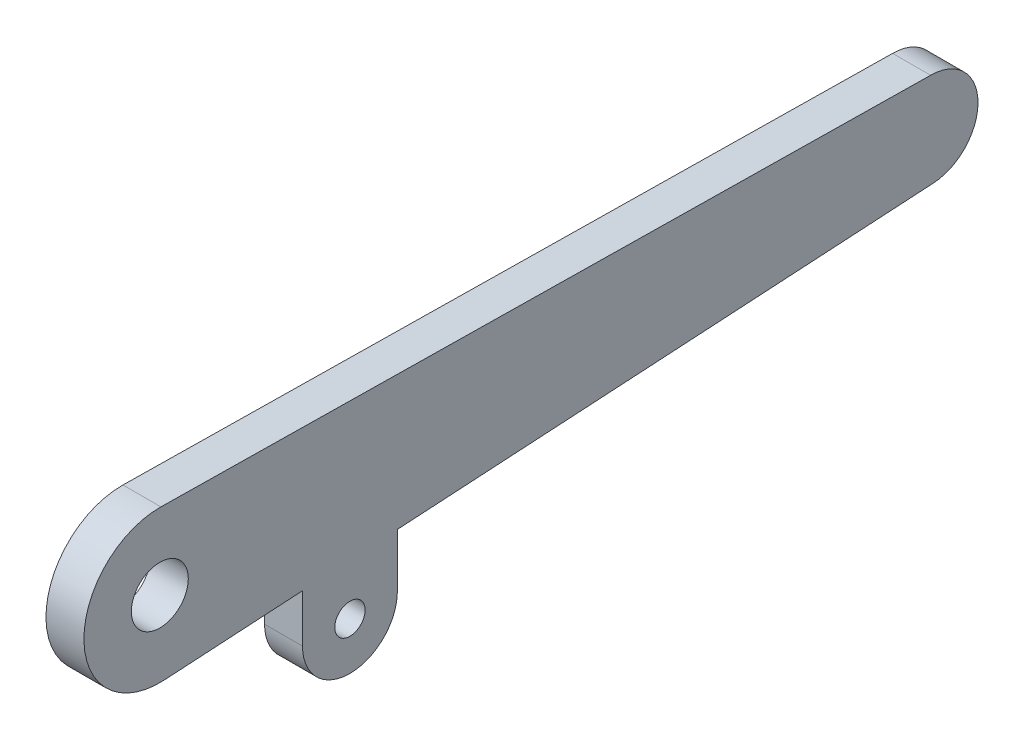
ISO-10303-21;
HEADER;
FILE_DESCRIPTION(('STEP AP214'),'2;1');
FILE_NAME('part.step','',(''),(''),'','','');
FILE_SCHEMA(('AUTOMOTIVE_DESIGN { 1 0 10303 214 1 1 1 1 }'));
ENDSEC;
DATA;
#1=APPLICATION_CONTEXT('core data for automotive mechanical design processes');
#2=APPLICATION_PROTOCOL_DEFINITION('international standard','automotive_design',2000,#1);
#3=PRODUCT_CONTEXT('',#1,'mechanical');
#4=PRODUCT('Part','Part','',(#3));
#5=PRODUCT_RELATED_PRODUCT_CATEGORY('part','',(#4));
#6=PRODUCT_DEFINITION_FORMATION('','',#4);
#7=PRODUCT_DEFINITION_CONTEXT('part definition',#1,'design');
#8=PRODUCT_DEFINITION('design','',#6,#7);
#9=PRODUCT_DEFINITION_SHAPE('','',#8);
#10=(LENGTH_UNIT() NAMED_UNIT(*) SI_UNIT(.MILLI.,.METRE.));
#11=(NAMED_UNIT(*) PLANE_ANGLE_UNIT() SI_UNIT($,.RADIAN.));
#12=(NAMED_UNIT(*) SI_UNIT($,.STERADIAN.) SOLID_ANGLE_UNIT());
#13=UNCERTAINTY_MEASURE_WITH_UNIT(LENGTH_MEASURE(1.E-05),#10,'distance_accuracy_value','');
#14=(GEOMETRIC_REPRESENTATION_CONTEXT(3) GLOBAL_UNCERTAINTY_ASSIGNED_CONTEXT((#13)) GLOBAL_UNIT_ASSIGNED_CONTEXT((#10,
#11,#12)) REPRESENTATION_CONTEXT('',''));
#15=CARTESIAN_POINT('',(0.,0.,0.));
#16=DIRECTION('',(0.,0.,1.));
#17=DIRECTION('',(1.,0.,0.));
#18=AXIS2_PLACEMENT_3D('',#15,#16,#17);
#19=CARTESIAN_POINT('',(4.,0.,0.));
#20=DIRECTION('',(1.,0.,0.));
#21=DIRECTION('',(0.,0.,-1.));
#22=AXIS2_PLACEMENT_3D('',#19,#20,#21);
#23=PLANE('',#22);
#24=CARTESIAN_POINT('',(4.,-12.1735942097107,-20.0375638568582));
#25=DIRECTION('',(1.,0.,0.));
#26=DIRECTION('',(0.,0.,-1.));
#27=AXIS2_PLACEMENT_3D('',#24,#25,#26);
#28=CIRCLE('',#27,1.6);
#29=CARTESIAN_POINT('',(4.,-12.1735942097107,-21.6375638568582));
#30=VERTEX_POINT('',#29);
#31=EDGE_CURVE('E135',#30,#30,#28,.T.);
#32=ORIENTED_EDGE('',*,*,#31,.F.);
#33=EDGE_LOOP('',(#32));
#34=FACE_BOUND('',#33,.T.);
#35=CARTESIAN_POINT('',(4.,0.,0.));
#36=DIRECTION('',(1.,0.,0.));
#37=DIRECTION('',(0.,0.,-1.));
#38=AXIS2_PLACEMENT_3D('',#35,#36,#37);
#39=CIRCLE('',#38,8.);
#40=CARTESIAN_POINT('',(4.,7.99917321703442,-0.115012364027337));
#41=VERTEX_POINT('',#40);
#42=CARTESIAN_POINT('',(4.,-7.98585386877995,-0.475539679198605));
#43=VERTEX_POINT('',#42);
#44=EDGE_CURVE('E146',#41,#43,#39,.T.);
#45=ORIENTED_EDGE('',*,*,#44,.T.);
#46=DIRECTION('',(0.,0.0594424598998259,-0.998231733597494));
#47=VECTOR('',#46,1.);
#48=CARTESIAN_POINT('',(4.,-7.98585386877995,-0.475539679198605));
#49=LINE('',#48,#47);
#50=CARTESIAN_POINT('',(4.,-7.11871800332183,-15.0375638568582));
#51=VERTEX_POINT('',#50);
#52=EDGE_CURVE('E94',#43,#51,#49,.T.);
#53=ORIENTED_EDGE('',*,*,#52,.T.);
#54=DIRECTION('',(0.,-1.,0.));
#55=VECTOR('',#54,1.);
#56=CARTESIAN_POINT('',(4.,-12.1735942097107,-15.0375638568582));
#57=LINE('',#56,#55);
#58=CARTESIAN_POINT('',(4.,-12.1735942097107,-15.0375638568582));
#59=VERTEX_POINT('',#58);
#60=EDGE_CURVE('E161',#51,#59,#57,.T.);
#61=ORIENTED_EDGE('',*,*,#60,.T.);
#62=CARTESIAN_POINT('',(4.,-12.1735942097107,-20.0375638568582));
#63=DIRECTION('',(1.,0.,0.));
#64=DIRECTION('',(0.,0.,-1.));
#65=AXIS2_PLACEMENT_3D('',#62,#63,#64);
#66=CIRCLE('',#65,5.);
#67=CARTESIAN_POINT('',(4.,-12.1735942097107,-25.0375638568582));
#68=VERTEX_POINT('',#67);
#69=EDGE_CURVE('E174',#59,#68,#66,.T.);
#70=ORIENTED_EDGE('',*,*,#69,.T.);
#71=DIRECTION('',(0.,1.,0.));
#72=VECTOR('',#71,1.);
#73=CARTESIAN_POINT('',(4.,-12.1735942097107,-25.0375638568582));
#74=LINE('',#73,#72);
#75=CARTESIAN_POINT('',(4.,-6.5232404413573,-25.0375638568582));
#76=VERTEX_POINT('',#75);
#77=EDGE_CURVE('E113',#68,#76,#74,.T.);
#78=ORIENTED_EDGE('',*,*,#77,.T.);
#79=DIRECTION('',(0.,0.0594424598998256,-0.998231733597494));
#80=VECTOR('',#79,1.);
#81=CARTESIAN_POINT('',(4.,-6.5232404413573,-25.0375638568582));
#82=LINE('',#81,#80);
#83=CARTESIAN_POINT('',(4.,-3.15848283091089,-81.5427594404807));
#84=VERTEX_POINT('',#83);
#85=EDGE_CURVE('E107',#76,#84,#82,.T.);
#86=ORIENTED_EDGE('',*,*,#85,.T.);
#87=CARTESIAN_POINT('',(4.,1.83267583707658,-81.2455471409816));
#88=DIRECTION('',(1.,0.,0.));
#89=DIRECTION('',(0.,0.,-1.));
#90=AXIS2_PLACEMENT_3D('',#87,#88,#89);
#91=CIRCLE('',#90,5.);
#92=CARTESIAN_POINT('',(4.,6.83267583707658,-81.2455471409816));
#93=VERTEX_POINT('',#92);
#94=EDGE_CURVE('E111',#84,#93,#91,.T.);
#95=ORIENTED_EDGE('',*,*,#94,.T.);
#96=DIRECTION('',(0.,0.0143765455034171,0.999896652129303));
#97=VECTOR('',#96,1.);
#98=CARTESIAN_POINT('',(4.,7.99917321703442,-0.115012364027337));
#99=LINE('',#98,#97);
#100=EDGE_CURVE('E51',#93,#41,#99,.T.);
#101=ORIENTED_EDGE('',*,*,#100,.T.);
#102=EDGE_LOOP('',(#45,#53,#61,#70,#78,#86,#95,#101));
#103=FACE_BOUND('',#102,.T.);
#104=CARTESIAN_POINT('',(4.,0.,0.));
#105=DIRECTION('',(1.,0.,0.));
#106=DIRECTION('',(0.,0.,-1.));
#107=AXIS2_PLACEMENT_3D('',#104,#105,#106);
#108=CIRCLE('',#107,3.);
#109=CARTESIAN_POINT('',(4.,0.,-3.));
#110=VERTEX_POINT('',#109);
#111=EDGE_CURVE('E183',#110,#110,#108,.T.);
#112=ORIENTED_EDGE('',*,*,#111,.F.);
#113=EDGE_LOOP('',(#112));
#114=FACE_BOUND('',#113,.T.);
#115=ADVANCED_FACE('F34',(#34,#103,#114),#23,.T.);
#116=CARTESIAN_POINT('',(0.,0.,0.));
#117=DIRECTION('',(1.,0.,0.));
#118=DIRECTION('',(0.,0.,-1.));
#119=AXIS2_PLACEMENT_3D('',#116,#117,#118);
#120=PLANE('',#119);
#121=CARTESIAN_POINT('',(0.,0.,0.));
#122=DIRECTION('',(1.,0.,0.));
#123=DIRECTION('',(0.,0.,-1.));
#124=AXIS2_PLACEMENT_3D('',#121,#122,#123);
#125=CIRCLE('',#124,8.);
#126=CARTESIAN_POINT('',(0.,7.99917321703442,-0.115012364027337));
#127=VERTEX_POINT('',#126);
#128=CARTESIAN_POINT('',(0.,-7.98585386877995,-0.475539679198605));
#129=VERTEX_POINT('',#128);
#130=EDGE_CURVE('E131',#127,#129,#125,.T.);
#131=ORIENTED_EDGE('',*,*,#130,.F.);
#132=DIRECTION('',(0.,0.0143765455034171,0.999896652129303));
#133=VECTOR('',#132,1.);
#134=CARTESIAN_POINT('',(0.,7.99917321703442,-0.115012364027337));
#135=LINE('',#134,#133);
#136=CARTESIAN_POINT('',(0.,6.83267583707658,-81.2455471409816));
#137=VERTEX_POINT('',#136);
#138=EDGE_CURVE('E86',#137,#127,#135,.T.);
#139=ORIENTED_EDGE('',*,*,#138,.F.);
#140=CARTESIAN_POINT('',(0.,1.83267583707658,-81.2455471409816));
#141=DIRECTION('',(1.,0.,0.));
#142=DIRECTION('',(0.,0.,-1.));
#143=AXIS2_PLACEMENT_3D('',#140,#141,#142);
#144=CIRCLE('',#143,5.);
#145=CARTESIAN_POINT('',(0.,-3.15848283091089,-81.5427594404807));
#146=VERTEX_POINT('',#145);
#147=EDGE_CURVE('E80',#146,#137,#144,.T.);
#148=ORIENTED_EDGE('',*,*,#147,.F.);
#149=DIRECTION('',(0.,0.0594424598998256,-0.998231733597494));
#150=VECTOR('',#149,1.);
#151=CARTESIAN_POINT('',(0.,-6.5232404413573,-25.0375638568582));
#152=LINE('',#151,#150);
#153=CARTESIAN_POINT('',(0.,-6.5232404413573,-25.0375638568582));
#154=VERTEX_POINT('',#153);
#155=EDGE_CURVE('E121',#154,#146,#152,.T.);
#156=ORIENTED_EDGE('',*,*,#155,.F.);
#157=DIRECTION('',(0.,1.,0.));
#158=VECTOR('',#157,1.);
#159=CARTESIAN_POINT('',(0.,-12.1735942097107,-25.0375638568582));
#160=LINE('',#159,#158);
#161=CARTESIAN_POINT('',(0.,-12.1735942097107,-25.0375638568582));
#162=VERTEX_POINT('',#161);
#163=EDGE_CURVE('E141',#162,#154,#160,.T.);
#164=ORIENTED_EDGE('',*,*,#163,.F.);
#165=CARTESIAN_POINT('',(0.,-12.1735942097107,-20.0375638568582));
#166=DIRECTION('',(1.,0.,0.));
#167=DIRECTION('',(0.,0.,-1.));
#168=AXIS2_PLACEMENT_3D('',#165,#166,#167);
#169=CIRCLE('',#168,5.);
#170=CARTESIAN_POINT('',(0.,-12.1735942097107,-15.0375638568582));
#171=VERTEX_POINT('',#170);
#172=EDGE_CURVE('E139',#171,#162,#169,.T.);
#173=ORIENTED_EDGE('',*,*,#172,.F.);
#174=DIRECTION('',(0.,-1.,0.));
#175=VECTOR('',#174,1.);
#176=CARTESIAN_POINT('',(0.,-12.1735942097107,-15.0375638568582));
#177=LINE('',#176,#175);
#178=CARTESIAN_POINT('',(0.,-7.11871800332183,-15.0375638568582));
#179=VERTEX_POINT('',#178);
#180=EDGE_CURVE('E137',#179,#171,#177,.T.);
#181=ORIENTED_EDGE('',*,*,#180,.F.);
#182=DIRECTION('',(0.,0.0594424598998259,-0.998231733597494));
#183=VECTOR('',#182,1.);
#184=CARTESIAN_POINT('',(0.,-7.98585386877995,-0.475539679198605));
#185=LINE('',#184,#183);
#186=EDGE_CURVE('E134',#129,#179,#185,.T.);
#187=ORIENTED_EDGE('',*,*,#186,.F.);
#188=EDGE_LOOP('',(#131,#139,#148,#156,#164,#173,#181,#187));
#189=FACE_BOUND('',#188,.T.);
#190=CARTESIAN_POINT('',(0.,-12.1735942097107,-20.0375638568582));
#191=DIRECTION('',(1.,0.,0.));
#192=DIRECTION('',(0.,0.,-1.));
#193=AXIS2_PLACEMENT_3D('',#190,#191,#192);
#194=CIRCLE('',#193,1.6);
#195=CARTESIAN_POINT('',(0.,-12.1735942097107,-21.6375638568582));
#196=VERTEX_POINT('',#195);
#197=EDGE_CURVE('E180',#196,#196,#194,.T.);
#198=ORIENTED_EDGE('',*,*,#197,.T.);
#199=EDGE_LOOP('',(#198));
#200=FACE_BOUND('',#199,.T.);
#201=CARTESIAN_POINT('',(0.,0.,0.));
#202=DIRECTION('',(1.,0.,0.));
#203=DIRECTION('',(0.,0.,-1.));
#204=AXIS2_PLACEMENT_3D('',#201,#202,#203);
#205=CIRCLE('',#204,3.);
#206=CARTESIAN_POINT('',(0.,0.,-3.));
#207=VERTEX_POINT('',#206);
#208=EDGE_CURVE('E186',#207,#207,#205,.T.);
#209=ORIENTED_EDGE('',*,*,#208,.T.);
#210=EDGE_LOOP('',(#209));
#211=FACE_BOUND('',#210,.T.);
#212=ADVANCED_FACE('F165',(#189,#200,#211),#120,.F.);
#213=CARTESIAN_POINT('',(4.,0.,0.));
#214=DIRECTION('',(-1.,0.,0.));
#215=DIRECTION('',(0.,0.,1.));
#216=AXIS2_PLACEMENT_3D('',#213,#214,#215);
#217=CYLINDRICAL_SURFACE('',#216,8.);
#218=ORIENTED_EDGE('',*,*,#130,.T.);
#219=DIRECTION('',(-1.,0.,0.));
#220=VECTOR('',#219,1.);
#221=CARTESIAN_POINT('',(4.,-7.98585386877995,-0.475539679198605));
#222=LINE('',#221,#220);
#223=EDGE_CURVE('E11',#43,#129,#222,.T.);
#224=ORIENTED_EDGE('',*,*,#223,.F.);
#225=ORIENTED_EDGE('',*,*,#44,.F.);
#226=DIRECTION('',(-1.,0.,0.));
#227=VECTOR('',#226,1.);
#228=CARTESIAN_POINT('',(4.,7.99917321703442,-0.115012364027337));
#229=LINE('',#228,#227);
#230=EDGE_CURVE('E127',#41,#127,#229,.T.);
#231=ORIENTED_EDGE('',*,*,#230,.T.);
#232=EDGE_LOOP('',(#218,#224,#225,#231));
#233=FACE_BOUND('',#232,.T.);
#234=ADVANCED_FACE('F36',(#233),#217,.T.);
#235=CARTESIAN_POINT('',(4.,-7.98585386877995,-0.475539679198605));
#236=DIRECTION('',(0.,0.998231733597494,0.0594424598998259));
#237=DIRECTION('',(0.,-0.0594424598998259,0.998231733597494));
#238=AXIS2_PLACEMENT_3D('',#235,#236,#237);
#239=PLANE('',#238);
#240=ORIENTED_EDGE('',*,*,#186,.T.);
#241=DIRECTION('',(-1.,0.,0.));
#242=VECTOR('',#241,1.);
#243=CARTESIAN_POINT('',(4.,-7.11871800332183,-15.0375638568582));
#244=LINE('',#243,#242);
#245=EDGE_CURVE('E43',#51,#179,#244,.T.);
#246=ORIENTED_EDGE('',*,*,#245,.F.);
#247=ORIENTED_EDGE('',*,*,#52,.F.);
#248=ORIENTED_EDGE('',*,*,#223,.T.);
#249=EDGE_LOOP('',(#240,#246,#247,#248));
#250=FACE_BOUND('',#249,.T.);
#251=ADVANCED_FACE('F218',(#250),#239,.F.);
#252=CARTESIAN_POINT('',(4.,-12.1735942097107,-15.0375638568582));
#253=DIRECTION('',(0.,0.,-1.));
#254=DIRECTION('',(-1.,0.,0.));
#255=AXIS2_PLACEMENT_3D('',#252,#253,#254);
#256=PLANE('',#255);
#257=ORIENTED_EDGE('',*,*,#180,.T.);
#258=DIRECTION('',(-1.,0.,0.));
#259=VECTOR('',#258,1.);
#260=CARTESIAN_POINT('',(4.,-12.1735942097107,-15.0375638568582));
#261=LINE('',#260,#259);
#262=EDGE_CURVE('E153',#59,#171,#261,.T.);
#263=ORIENTED_EDGE('',*,*,#262,.F.);
#264=ORIENTED_EDGE('',*,*,#60,.F.);
#265=ORIENTED_EDGE('',*,*,#245,.T.);
#266=EDGE_LOOP('',(#257,#263,#264,#265));
#267=FACE_BOUND('',#266,.T.);
#268=ADVANCED_FACE('F159',(#267),#256,.F.);
#269=CARTESIAN_POINT('',(4.,-12.1735942097107,-20.0375638568582));
#270=DIRECTION('',(-1.,0.,0.));
#271=DIRECTION('',(0.,0.,1.));
#272=AXIS2_PLACEMENT_3D('',#269,#270,#271);
#273=CYLINDRICAL_SURFACE('',#272,5.);
#274=ORIENTED_EDGE('',*,*,#172,.T.);
#275=DIRECTION('',(-1.,0.,0.));
#276=VECTOR('',#275,1.);
#277=CARTESIAN_POINT('',(4.,-12.1735942097107,-25.0375638568582));
#278=LINE('',#277,#276);
#279=EDGE_CURVE('E150',#68,#162,#278,.T.);
#280=ORIENTED_EDGE('',*,*,#279,.F.);
#281=ORIENTED_EDGE('',*,*,#69,.F.);
#282=ORIENTED_EDGE('',*,*,#262,.T.);
#283=EDGE_LOOP('',(#274,#280,#281,#282));
#284=FACE_BOUND('',#283,.T.);
#285=ADVANCED_FACE('F170',(#284),#273,.T.);
#286=CARTESIAN_POINT('',(4.,-12.1735942097107,-25.0375638568582));
#287=DIRECTION('',(0.,0.,1.));
#288=DIRECTION('',(1.,0.,0.));
#289=AXIS2_PLACEMENT_3D('',#286,#287,#288);
#290=PLANE('',#289);
#291=ORIENTED_EDGE('',*,*,#163,.T.);
#292=DIRECTION('',(-1.,0.,0.));
#293=VECTOR('',#292,1.);
#294=CARTESIAN_POINT('',(4.,-6.5232404413573,-25.0375638568582));
#295=LINE('',#294,#293);
#296=EDGE_CURVE('E122',#76,#154,#295,.T.);
#297=ORIENTED_EDGE('',*,*,#296,.F.);
#298=ORIENTED_EDGE('',*,*,#77,.F.);
#299=ORIENTED_EDGE('',*,*,#279,.T.);
#300=EDGE_LOOP('',(#291,#297,#298,#299));
#301=FACE_BOUND('',#300,.T.);
#302=ADVANCED_FACE('F173',(#301),#290,.F.);
#303=CARTESIAN_POINT('',(4.,-6.5232404413573,-25.0375638568582));
#304=DIRECTION('',(0.,0.998231733597494,0.0594424598998256));
#305=DIRECTION('',(0.,-0.0594424598998256,0.998231733597494));
#306=AXIS2_PLACEMENT_3D('',#303,#304,#305);
#307=PLANE('',#306);
#308=ORIENTED_EDGE('',*,*,#155,.T.);
#309=DIRECTION('',(-1.,0.,0.));
#310=VECTOR('',#309,1.);
#311=CARTESIAN_POINT('',(4.,-3.15848283091089,-81.5427594404807));
#312=LINE('',#311,#310);
#313=EDGE_CURVE('E118',#84,#146,#312,.T.);
#314=ORIENTED_EDGE('',*,*,#313,.F.);
#315=ORIENTED_EDGE('',*,*,#85,.F.);
#316=ORIENTED_EDGE('',*,*,#296,.T.);
#317=EDGE_LOOP('',(#308,#314,#315,#316));
#318=FACE_BOUND('',#317,.T.);
#319=ADVANCED_FACE('F119',(#318),#307,.F.);
#320=CARTESIAN_POINT('',(4.,1.83267583707658,-81.2455471409816));
#321=DIRECTION('',(-1.,0.,0.));
#322=DIRECTION('',(0.,0.,1.));
#323=AXIS2_PLACEMENT_3D('',#320,#321,#322);
#324=CYLINDRICAL_SURFACE('',#323,5.);
#325=ORIENTED_EDGE('',*,*,#147,.T.);
#326=DIRECTION('',(-1.,0.,0.));
#327=VECTOR('',#326,1.);
#328=CARTESIAN_POINT('',(4.,6.83267583707658,-81.2455471409816));
#329=LINE('',#328,#327);
#330=EDGE_CURVE('E123',#93,#137,#329,.T.);
#331=ORIENTED_EDGE('',*,*,#330,.F.);
#332=ORIENTED_EDGE('',*,*,#94,.F.);
#333=ORIENTED_EDGE('',*,*,#313,.T.);
#334=EDGE_LOOP('',(#325,#331,#332,#333));
#335=FACE_BOUND('',#334,.T.);
#336=ADVANCED_FACE('F125',(#335),#324,.T.);
#337=CARTESIAN_POINT('',(4.,7.99917321703442,-0.115012364027337));
#338=DIRECTION('',(0.,-0.999896652129303,0.0143765455034171));
#339=DIRECTION('',(0.,-0.0143765455034171,-0.999896652129303));
#340=AXIS2_PLACEMENT_3D('',#337,#338,#339);
#341=PLANE('',#340);
#342=ORIENTED_EDGE('',*,*,#138,.T.);
#343=ORIENTED_EDGE('',*,*,#230,.F.);
#344=ORIENTED_EDGE('',*,*,#100,.F.);
#345=ORIENTED_EDGE('',*,*,#330,.T.);
#346=EDGE_LOOP('',(#342,#343,#344,#345));
#347=FACE_BOUND('',#346,.T.);
#348=ADVANCED_FACE('F206',(#347),#341,.F.);
#349=CARTESIAN_POINT('',(4.,-12.1735942097107,-20.0375638568582));
#350=DIRECTION('',(-1.,0.,0.));
#351=DIRECTION('',(0.,0.,1.));
#352=AXIS2_PLACEMENT_3D('',#349,#350,#351);
#353=CYLINDRICAL_SURFACE('',#352,1.6);
#354=ORIENTED_EDGE('',*,*,#31,.T.);
#355=EDGE_LOOP('',(#354));
#356=FACE_BOUND('',#355,.T.);
#357=ORIENTED_EDGE('',*,*,#197,.F.);
#358=EDGE_LOOP('',(#357));
#359=FACE_BOUND('',#358,.T.);
#360=ADVANCED_FACE('F203',(#356,#359),#353,.F.);
#361=CARTESIAN_POINT('',(4.,0.,0.));
#362=DIRECTION('',(-1.,0.,0.));
#363=DIRECTION('',(0.,0.,1.));
#364=AXIS2_PLACEMENT_3D('',#361,#362,#363);
#365=CYLINDRICAL_SURFACE('',#364,3.);
#366=ORIENTED_EDGE('',*,*,#111,.T.);
#367=EDGE_LOOP('',(#366));
#368=FACE_BOUND('',#367,.T.);
#369=ORIENTED_EDGE('',*,*,#208,.F.);
#370=EDGE_LOOP('',(#369));
#371=FACE_BOUND('',#370,.T.);
#372=ADVANCED_FACE('F192',(#368,#371),#365,.F.);
#373=CLOSED_SHELL('',(#115,#212,#234,#251,#268,#285,#302,#319,#336,#348,#360,#372));
#374=MANIFOLD_SOLID_BREP('B2',#373);
#375=ADVANCED_BREP_SHAPE_REPRESENTATION('',(#18,#374),#14);
#376=SHAPE_DEFINITION_REPRESENTATION(#9,#375);
ENDSEC;
END-ISO-10303-21;
